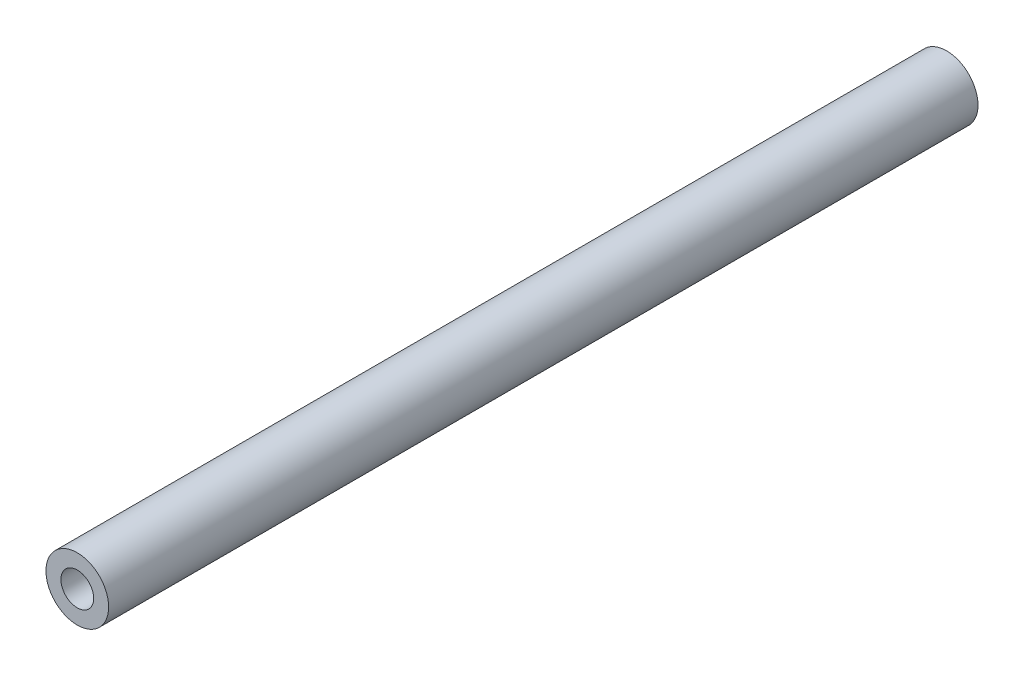
ISO-10303-21;
HEADER;
FILE_DESCRIPTION(('STEP AP214'),'2;1');
FILE_NAME('part.step','',(''),(''),'','','');
FILE_SCHEMA(('AUTOMOTIVE_DESIGN { 1 0 10303 214 1 1 1 1 }'));
ENDSEC;
DATA;
#1=APPLICATION_CONTEXT('core data for automotive mechanical design processes');
#2=APPLICATION_PROTOCOL_DEFINITION('international standard','automotive_design',2000,#1);
#3=PRODUCT_CONTEXT('',#1,'mechanical');
#4=PRODUCT('Part','Part','',(#3));
#5=PRODUCT_RELATED_PRODUCT_CATEGORY('part','',(#4));
#6=PRODUCT_DEFINITION_FORMATION('','',#4);
#7=PRODUCT_DEFINITION_CONTEXT('part definition',#1,'design');
#8=PRODUCT_DEFINITION('design','',#6,#7);
#9=PRODUCT_DEFINITION_SHAPE('','',#8);
#10=(LENGTH_UNIT() NAMED_UNIT(*) SI_UNIT(.MILLI.,.METRE.));
#11=(NAMED_UNIT(*) PLANE_ANGLE_UNIT() SI_UNIT($,.RADIAN.));
#12=(NAMED_UNIT(*) SI_UNIT($,.STERADIAN.) SOLID_ANGLE_UNIT());
#13=UNCERTAINTY_MEASURE_WITH_UNIT(LENGTH_MEASURE(1.E-05),#10,'distance_accuracy_value','');
#14=(GEOMETRIC_REPRESENTATION_CONTEXT(3) GLOBAL_UNCERTAINTY_ASSIGNED_CONTEXT((#13)) GLOBAL_UNIT_ASSIGNED_CONTEXT((#10,
#11,#12)) REPRESENTATION_CONTEXT('',''));
#15=CARTESIAN_POINT('',(0.,0.,0.));
#16=DIRECTION('',(0.,0.,1.));
#17=DIRECTION('',(1.,0.,0.));
#18=AXIS2_PLACEMENT_3D('',#15,#16,#17);
#19=CARTESIAN_POINT('',(196.85,227.076,132.08));
#20=DIRECTION('',(0.,0.,1.));
#21=DIRECTION('',(1.,0.,0.));
#22=AXIS2_PLACEMENT_3D('',#19,#20,#21);
#23=PLANE('',#22);
#24=CARTESIAN_POINT('',(196.85,227.076,132.08));
#25=DIRECTION('',(0.,0.,1.));
#26=DIRECTION('',(1.,0.,0.));
#27=AXIS2_PLACEMENT_3D('',#24,#25,#26);
#28=CIRCLE('',#27,4.76250000000001);
#29=CARTESIAN_POINT('',(201.6125,227.076,132.08));
#30=VERTEX_POINT('',#29);
#31=EDGE_CURVE('E10',#30,#30,#28,.T.);
#32=ORIENTED_EDGE('',*,*,#31,.T.);
#33=EDGE_LOOP('',(#32));
#34=FACE_BOUND('',#33,.T.);
#35=CARTESIAN_POINT('',(196.85,227.076,132.08));
#36=DIRECTION('',(0.,0.,1.));
#37=DIRECTION('',(1.,0.,0.));
#38=AXIS2_PLACEMENT_3D('',#35,#36,#37);
#39=CIRCLE('',#38,2.48920000000001);
#40=CARTESIAN_POINT('',(199.3392,227.076,132.08));
#41=VERTEX_POINT('',#40);
#42=EDGE_CURVE('E52',#41,#41,#39,.T.);
#43=ORIENTED_EDGE('',*,*,#42,.F.);
#44=EDGE_LOOP('',(#43));
#45=FACE_BOUND('',#44,.T.);
#46=ADVANCED_FACE('F41',(#34,#45),#23,.T.);
#47=CARTESIAN_POINT('',(196.85,227.076,0.));
#48=DIRECTION('',(0.,0.,1.));
#49=DIRECTION('',(1.,0.,0.));
#50=AXIS2_PLACEMENT_3D('',#47,#48,#49);
#51=PLANE('',#50);
#52=CARTESIAN_POINT('',(196.85,227.076,0.));
#53=DIRECTION('',(0.,0.,1.));
#54=DIRECTION('',(1.,0.,0.));
#55=AXIS2_PLACEMENT_3D('',#52,#53,#54);
#56=CIRCLE('',#55,4.76250000000001);
#57=CARTESIAN_POINT('',(201.6125,227.076,0.));
#58=VERTEX_POINT('',#57);
#59=EDGE_CURVE('E45',#58,#58,#56,.T.);
#60=ORIENTED_EDGE('',*,*,#59,.F.);
#61=EDGE_LOOP('',(#60));
#62=FACE_BOUND('',#61,.T.);
#63=CARTESIAN_POINT('',(196.85,227.076,0.));
#64=DIRECTION('',(0.,0.,1.));
#65=DIRECTION('',(1.,0.,0.));
#66=AXIS2_PLACEMENT_3D('',#63,#64,#65);
#67=CIRCLE('',#66,2.48920000000001);
#68=CARTESIAN_POINT('',(199.3392,227.076,0.));
#69=VERTEX_POINT('',#68);
#70=EDGE_CURVE('E54',#69,#69,#67,.T.);
#71=ORIENTED_EDGE('',*,*,#70,.T.);
#72=EDGE_LOOP('',(#71));
#73=FACE_BOUND('',#72,.T.);
#74=ADVANCED_FACE('F64',(#62,#73),#51,.F.);
#75=CARTESIAN_POINT('',(196.85,227.076,132.08));
#76=DIRECTION('',(0.,0.,-1.));
#77=DIRECTION('',(-1.,0.,0.));
#78=AXIS2_PLACEMENT_3D('',#75,#76,#77);
#79=CYLINDRICAL_SURFACE('',#78,4.76250000000001);
#80=ORIENTED_EDGE('',*,*,#31,.F.);
#81=EDGE_LOOP('',(#80));
#82=FACE_BOUND('',#81,.T.);
#83=ORIENTED_EDGE('',*,*,#59,.T.);
#84=EDGE_LOOP('',(#83));
#85=FACE_BOUND('',#84,.T.);
#86=ADVANCED_FACE('F43',(#82,#85),#79,.T.);
#87=CARTESIAN_POINT('',(196.85,227.076,132.08));
#88=DIRECTION('',(0.,0.,-1.));
#89=DIRECTION('',(-1.,0.,0.));
#90=AXIS2_PLACEMENT_3D('',#87,#88,#89);
#91=CYLINDRICAL_SURFACE('',#90,2.48920000000001);
#92=ORIENTED_EDGE('',*,*,#42,.T.);
#93=EDGE_LOOP('',(#92));
#94=FACE_BOUND('',#93,.T.);
#95=ORIENTED_EDGE('',*,*,#70,.F.);
#96=EDGE_LOOP('',(#95));
#97=FACE_BOUND('',#96,.T.);
#98=ADVANCED_FACE('F60',(#94,#97),#91,.F.);
#99=CLOSED_SHELL('',(#46,#74,#86,#98));
#100=MANIFOLD_SOLID_BREP('B2',#99);
#101=ADVANCED_BREP_SHAPE_REPRESENTATION('',(#18,#100),#14);
#102=SHAPE_DEFINITION_REPRESENTATION(#9,#101);
ENDSEC;
END-ISO-10303-21;
